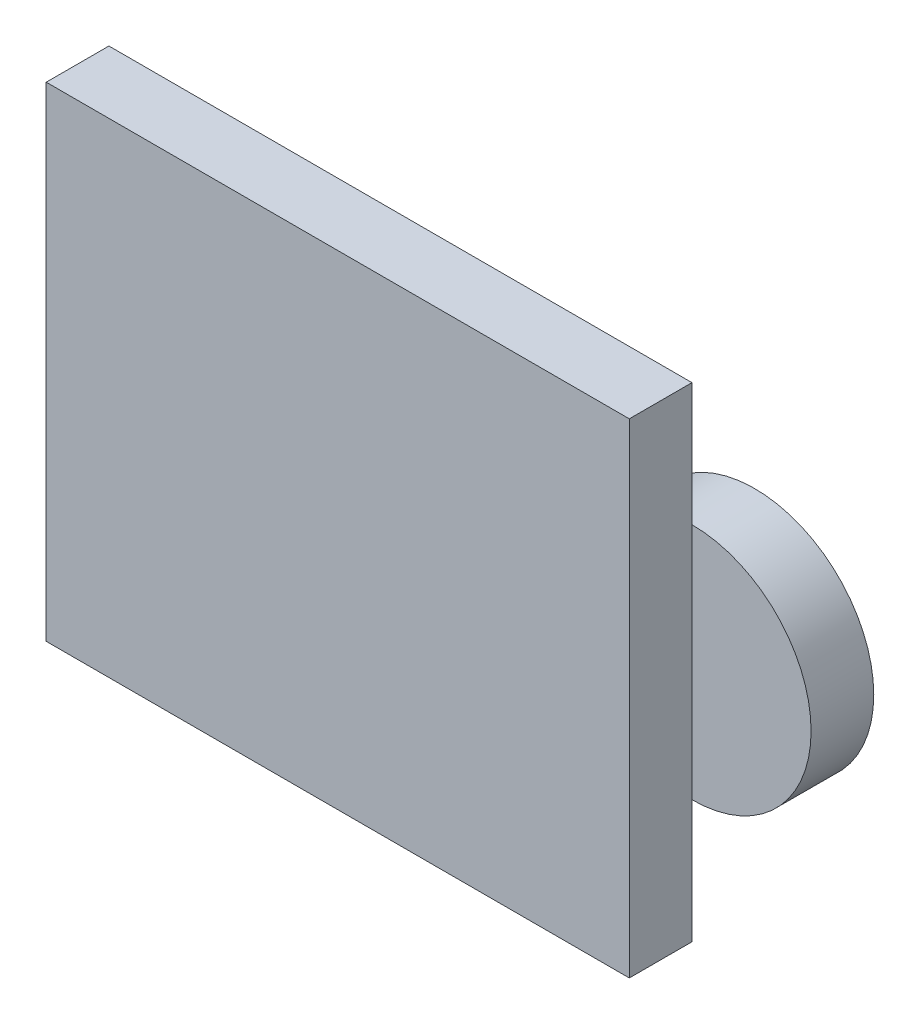
ISO-10303-21;
HEADER;
FILE_DESCRIPTION(('STEP AP214'),'2;1');
FILE_NAME('part.step','',(''),(''),'','','');
FILE_SCHEMA(('AUTOMOTIVE_DESIGN { 1 0 10303 214 1 1 1 1 }'));
ENDSEC;
DATA;
#1=APPLICATION_CONTEXT('core data for automotive mechanical design processes');
#2=APPLICATION_PROTOCOL_DEFINITION('international standard','automotive_design',2000,#1);
#3=PRODUCT_CONTEXT('',#1,'mechanical');
#4=PRODUCT('Part','Part','',(#3));
#5=PRODUCT_RELATED_PRODUCT_CATEGORY('part','',(#4));
#6=PRODUCT_DEFINITION_FORMATION('','',#4);
#7=PRODUCT_DEFINITION_CONTEXT('part definition',#1,'design');
#8=PRODUCT_DEFINITION('design','',#6,#7);
#9=PRODUCT_DEFINITION_SHAPE('','',#8);
#10=(LENGTH_UNIT() NAMED_UNIT(*) SI_UNIT(.MILLI.,.METRE.));
#11=(NAMED_UNIT(*) PLANE_ANGLE_UNIT() SI_UNIT($,.RADIAN.));
#12=(NAMED_UNIT(*) SI_UNIT($,.STERADIAN.) SOLID_ANGLE_UNIT());
#13=UNCERTAINTY_MEASURE_WITH_UNIT(LENGTH_MEASURE(1.E-05),#10,'distance_accuracy_value','');
#14=(GEOMETRIC_REPRESENTATION_CONTEXT(3) GLOBAL_UNCERTAINTY_ASSIGNED_CONTEXT((#13)) GLOBAL_UNIT_ASSIGNED_CONTEXT((#10,
#11,#12)) REPRESENTATION_CONTEXT('',''));
#15=CARTESIAN_POINT('',(0.,0.,0.));
#16=DIRECTION('',(0.,0.,1.));
#17=DIRECTION('',(1.,0.,0.));
#18=AXIS2_PLACEMENT_3D('',#15,#16,#17);
#19=CARTESIAN_POINT('',(-48.9939535172757,38.0205443698732,10.));
#20=DIRECTION('',(1.,0.,0.));
#21=DIRECTION('',(0.,0.,-1.));
#22=AXIS2_PLACEMENT_3D('',#19,#20,#21);
#23=PLANE('',#22);
#24=DIRECTION('',(0.,-1.,0.));
#25=VECTOR('',#24,1.);
#26=CARTESIAN_POINT('',(-48.9939535172757,38.0205443698732,0.));
#27=LINE('',#26,#25);
#28=CARTESIAN_POINT('',(-48.9939535172757,38.0205443698732,0.));
#29=VERTEX_POINT('',#28);
#30=CARTESIAN_POINT('',(-48.9939535172757,-39.2569848371862,0.));
#31=VERTEX_POINT('',#30);
#32=EDGE_CURVE('E123',#29,#31,#27,.T.);
#33=ORIENTED_EDGE('',*,*,#32,.T.);
#34=DIRECTION('',(0.,0.,-1.));
#35=VECTOR('',#34,1.);
#36=CARTESIAN_POINT('',(-48.9939535172757,-39.2569848371862,10.));
#37=LINE('',#36,#35);
#38=CARTESIAN_POINT('',(-48.9939535172757,-39.2569848371862,10.));
#39=VERTEX_POINT('',#38);
#40=EDGE_CURVE('E11',#39,#31,#37,.T.);
#41=ORIENTED_EDGE('',*,*,#40,.F.);
#42=DIRECTION('',(0.,-1.,0.));
#43=VECTOR('',#42,1.);
#44=CARTESIAN_POINT('',(-48.9939535172757,38.0205443698732,10.));
#45=LINE('',#44,#43);
#46=CARTESIAN_POINT('',(-48.9939535172757,38.0205443698732,10.));
#47=VERTEX_POINT('',#46);
#48=EDGE_CURVE('E116',#47,#39,#45,.T.);
#49=ORIENTED_EDGE('',*,*,#48,.F.);
#50=DIRECTION('',(0.,0.,-1.));
#51=VECTOR('',#50,1.);
#52=CARTESIAN_POINT('',(-48.9939535172757,38.0205443698732,10.));
#53=LINE('',#52,#51);
#54=EDGE_CURVE('E117',#47,#29,#53,.T.);
#55=ORIENTED_EDGE('',*,*,#54,.T.);
#56=EDGE_LOOP('',(#33,#41,#49,#55));
#57=FACE_BOUND('',#56,.T.);
#58=ADVANCED_FACE('F37',(#57),#23,.F.);
#59=CARTESIAN_POINT('',(-48.9939535172757,-39.2569848371862,10.));
#60=DIRECTION('',(0.,1.,0.));
#61=DIRECTION('',(0.,0.,1.));
#62=AXIS2_PLACEMENT_3D('',#59,#60,#61);
#63=PLANE('',#62);
#64=DIRECTION('',(1.,0.,0.));
#65=VECTOR('',#64,1.);
#66=CARTESIAN_POINT('',(-48.9939535172757,-39.2569848371862,0.));
#67=LINE('',#66,#65);
#68=CARTESIAN_POINT('',(44.0481916480239,-39.2569848371862,0.));
#69=VERTEX_POINT('',#68);
#70=EDGE_CURVE('E107',#31,#69,#67,.T.);
#71=ORIENTED_EDGE('',*,*,#70,.T.);
#72=DIRECTION('',(0.,0.,-1.));
#73=VECTOR('',#72,1.);
#74=CARTESIAN_POINT('',(44.0481916480239,-39.2569848371862,10.));
#75=LINE('',#74,#73);
#76=CARTESIAN_POINT('',(44.0481916480239,-39.2569848371862,10.));
#77=VERTEX_POINT('',#76);
#78=EDGE_CURVE('E44',#77,#69,#75,.T.);
#79=ORIENTED_EDGE('',*,*,#78,.F.);
#80=DIRECTION('',(1.,0.,0.));
#81=VECTOR('',#80,1.);
#82=CARTESIAN_POINT('',(-48.9939535172757,-39.2569848371862,10.));
#83=LINE('',#82,#81);
#84=EDGE_CURVE('E87',#39,#77,#83,.T.);
#85=ORIENTED_EDGE('',*,*,#84,.F.);
#86=ORIENTED_EDGE('',*,*,#40,.T.);
#87=EDGE_LOOP('',(#71,#79,#85,#86));
#88=FACE_BOUND('',#87,.T.);
#89=ADVANCED_FACE('F125',(#88),#63,.F.);
#90=CARTESIAN_POINT('',(44.0481916480239,38.0205443698732,10.));
#91=DIRECTION('',(-1.,0.,0.));
#92=DIRECTION('',(0.,0.,1.));
#93=AXIS2_PLACEMENT_3D('',#90,#91,#92);
#94=PLANE('',#93);
#95=DIRECTION('',(0.,1.,0.));
#96=VECTOR('',#95,1.);
#97=CARTESIAN_POINT('',(44.0481916480239,38.0205443698732,0.));
#98=LINE('',#97,#96);
#99=CARTESIAN_POINT('',(44.0481916480239,-19.6268076732686,0.));
#100=VERTEX_POINT('',#99);
#101=EDGE_CURVE('E109',#69,#100,#98,.T.);
#102=ORIENTED_EDGE('',*,*,#101,.T.);
#103=CARTESIAN_POINT('',(44.0481916480239,18.3903672059556,0.));
#104=VERTEX_POINT('',#103);
#105=EDGE_CURVE('E92',#100,#104,#98,.T.);
#106=ORIENTED_EDGE('',*,*,#105,.T.);
#107=CARTESIAN_POINT('',(44.0481916480239,38.0205443698732,0.));
#108=VERTEX_POINT('',#107);
#109=EDGE_CURVE('E102',#104,#108,#98,.T.);
#110=ORIENTED_EDGE('',*,*,#109,.T.);
#111=DIRECTION('',(0.,0.,-1.));
#112=VECTOR('',#111,1.);
#113=CARTESIAN_POINT('',(44.0481916480239,38.0205443698732,10.));
#114=LINE('',#113,#112);
#115=CARTESIAN_POINT('',(44.0481916480239,38.0205443698732,10.));
#116=VERTEX_POINT('',#115);
#117=EDGE_CURVE('E119',#116,#108,#114,.T.);
#118=ORIENTED_EDGE('',*,*,#117,.F.);
#119=DIRECTION('',(0.,1.,0.));
#120=VECTOR('',#119,1.);
#121=CARTESIAN_POINT('',(44.0481916480239,38.0205443698732,10.));
#122=LINE('',#121,#120);
#123=EDGE_CURVE('E121',#77,#116,#122,.T.);
#124=ORIENTED_EDGE('',*,*,#123,.F.);
#125=ORIENTED_EDGE('',*,*,#78,.T.);
#126=EDGE_LOOP('',(#102,#106,#110,#118,#124,#125));
#127=FACE_BOUND('',#126,.T.);
#128=ADVANCED_FACE('F110',(#127),#94,.F.);
#129=CARTESIAN_POINT('',(-48.9939535172757,38.0205443698732,10.));
#130=DIRECTION('',(0.,-1.,0.));
#131=DIRECTION('',(0.,0.,-1.));
#132=AXIS2_PLACEMENT_3D('',#129,#130,#131);
#133=PLANE('',#132);
#134=DIRECTION('',(-1.,0.,0.));
#135=VECTOR('',#134,1.);
#136=CARTESIAN_POINT('',(-48.9939535172757,38.0205443698732,0.));
#137=LINE('',#136,#135);
#138=EDGE_CURVE('E80',#108,#29,#137,.T.);
#139=ORIENTED_EDGE('',*,*,#138,.T.);
#140=ORIENTED_EDGE('',*,*,#54,.F.);
#141=DIRECTION('',(-1.,0.,0.));
#142=VECTOR('',#141,1.);
#143=CARTESIAN_POINT('',(-48.9939535172757,38.0205443698732,10.));
#144=LINE('',#143,#142);
#145=EDGE_CURVE('E59',#116,#47,#144,.T.);
#146=ORIENTED_EDGE('',*,*,#145,.F.);
#147=ORIENTED_EDGE('',*,*,#117,.T.);
#148=EDGE_LOOP('',(#139,#140,#146,#147));
#149=FACE_BOUND('',#148,.T.);
#150=ADVANCED_FACE('F135',(#149),#133,.F.);
#151=CARTESIAN_POINT('',(0.,0.,10.));
#152=DIRECTION('',(0.,0.,1.));
#153=DIRECTION('',(1.,0.,0.));
#154=AXIS2_PLACEMENT_3D('',#151,#152,#153);
#155=PLANE('',#154);
#156=ORIENTED_EDGE('',*,*,#48,.T.);
#157=ORIENTED_EDGE('',*,*,#84,.T.);
#158=ORIENTED_EDGE('',*,*,#123,.T.);
#159=ORIENTED_EDGE('',*,*,#145,.T.);
#160=EDGE_LOOP('',(#156,#157,#158,#159));
#161=FACE_BOUND('',#160,.T.);
#162=ADVANCED_FACE('F134',(#161),#155,.T.);
#163=CARTESIAN_POINT('',(0.,0.,0.));
#164=DIRECTION('',(0.,0.,1.));
#165=DIRECTION('',(1.,0.,0.));
#166=AXIS2_PLACEMENT_3D('',#163,#164,#165);
#167=PLANE('',#166);
#168=ORIENTED_EDGE('',*,*,#109,.F.);
#169=CARTESIAN_POINT('',(44.0481916480239,-0.618220233656479,0.));
#170=DIRECTION('',(0.,0.,1.));
#171=DIRECTION('',(1.,0.,0.));
#172=AXIS2_PLACEMENT_3D('',#169,#170,#171);
#173=CIRCLE('',#172,19.0085874396121);
#174=EDGE_CURVE('E94',#104,#100,#173,.T.);
#175=ORIENTED_EDGE('',*,*,#174,.T.);
#176=ORIENTED_EDGE('',*,*,#101,.F.);
#177=ORIENTED_EDGE('',*,*,#70,.F.);
#178=ORIENTED_EDGE('',*,*,#32,.F.);
#179=ORIENTED_EDGE('',*,*,#138,.F.);
#180=EDGE_LOOP('',(#168,#175,#176,#177,#178,#179));
#181=FACE_BOUND('',#180,.T.);
#182=ADVANCED_FACE('F103',(#181),#167,.F.);
#183=CARTESIAN_POINT('',(44.0481916480239,-0.618220233656479,0.));
#184=DIRECTION('',(0.,0.,1.));
#185=DIRECTION('',(1.,0.,0.));
#186=AXIS2_PLACEMENT_3D('',#183,#184,#185);
#187=PLANE('',#186);
#188=ORIENTED_EDGE('',*,*,#105,.F.);
#189=EDGE_CURVE('E50',#100,#104,#173,.T.);
#190=ORIENTED_EDGE('',*,*,#189,.T.);
#191=EDGE_LOOP('',(#188,#190));
#192=FACE_BOUND('',#191,.T.);
#193=ADVANCED_FACE('F90',(#192),#187,.T.);
#194=CARTESIAN_POINT('',(44.0481916480239,-0.618220233656479,-10.));
#195=DIRECTION('',(0.,0.,1.));
#196=DIRECTION('',(1.,0.,0.));
#197=AXIS2_PLACEMENT_3D('',#194,#195,#196);
#198=CYLINDRICAL_SURFACE('',#197,19.0085874396121);
#199=CARTESIAN_POINT('',(44.0481916480239,-0.618220233656479,-10.));
#200=DIRECTION('',(0.,0.,1.));
#201=DIRECTION('',(1.,0.,0.));
#202=AXIS2_PLACEMENT_3D('',#199,#200,#201);
#203=CIRCLE('',#202,19.0085874396121);
#204=CARTESIAN_POINT('',(63.0567790876359,-0.618220233656479,-10.));
#205=VERTEX_POINT('',#204);
#206=EDGE_CURVE('E101',#205,#205,#203,.T.);
#207=ORIENTED_EDGE('',*,*,#206,.T.);
#208=EDGE_LOOP('',(#207));
#209=FACE_BOUND('',#208,.T.);
#210=ORIENTED_EDGE('',*,*,#174,.F.);
#211=ORIENTED_EDGE('',*,*,#189,.F.);
#212=EDGE_LOOP('',(#210,#211));
#213=FACE_BOUND('',#212,.T.);
#214=ADVANCED_FACE('F97',(#209,#213),#198,.T.);
#215=CARTESIAN_POINT('',(44.0481916480239,-0.618220233656479,-10.));
#216=DIRECTION('',(0.,0.,1.));
#217=DIRECTION('',(1.,0.,0.));
#218=AXIS2_PLACEMENT_3D('',#215,#216,#217);
#219=PLANE('',#218);
#220=ORIENTED_EDGE('',*,*,#206,.F.);
#221=EDGE_LOOP('',(#220));
#222=FACE_BOUND('',#221,.T.);
#223=ADVANCED_FACE('F183',(#222),#219,.F.);
#224=CLOSED_SHELL('',(#58,#89,#128,#150,#162,#182,#193,#214,#223));
#225=MANIFOLD_SOLID_BREP('B2',#224);
#226=ADVANCED_BREP_SHAPE_REPRESENTATION('',(#18,#225),#14);
#227=SHAPE_DEFINITION_REPRESENTATION(#9,#226);
ENDSEC;
END-ISO-10303-21;
